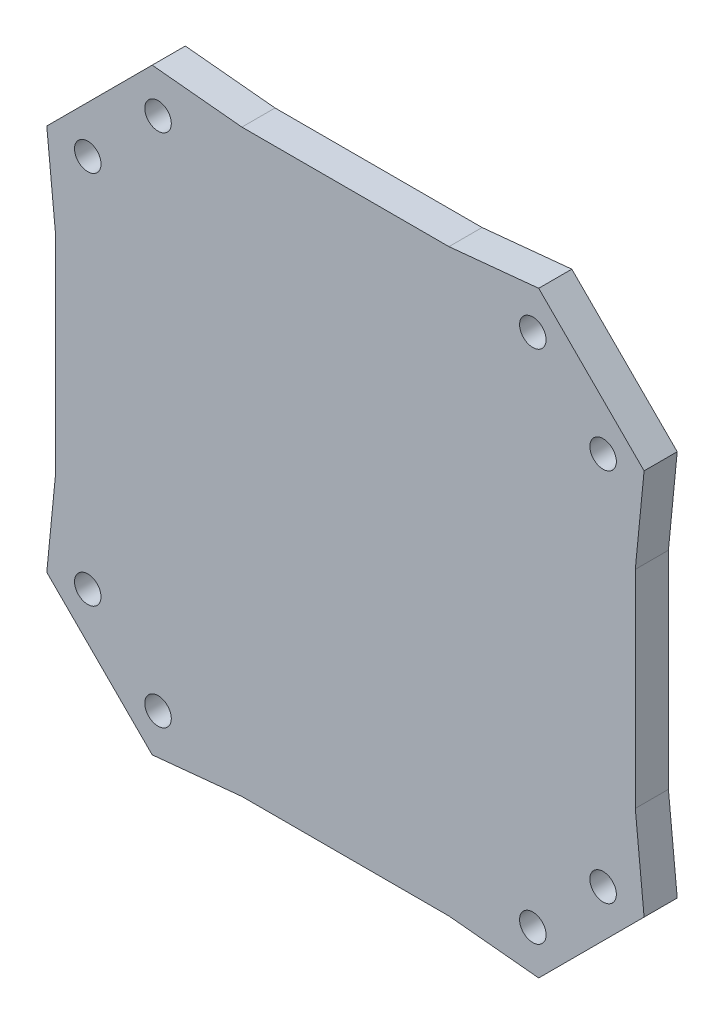
ISO-10303-21;
HEADER;
FILE_DESCRIPTION(('STEP AP214'),'2;1');
FILE_NAME('part.step','',(''),(''),'','','');
FILE_SCHEMA(('AUTOMOTIVE_DESIGN { 1 0 10303 214 1 1 1 1 }'));
ENDSEC;
DATA;
#1=APPLICATION_CONTEXT('core data for automotive mechanical design processes');
#2=APPLICATION_PROTOCOL_DEFINITION('international standard','automotive_design',2000,#1);
#3=PRODUCT_CONTEXT('',#1,'mechanical');
#4=PRODUCT('Part','Part','',(#3));
#5=PRODUCT_RELATED_PRODUCT_CATEGORY('part','',(#4));
#6=PRODUCT_DEFINITION_FORMATION('','',#4);
#7=PRODUCT_DEFINITION_CONTEXT('part definition',#1,'design');
#8=PRODUCT_DEFINITION('design','',#6,#7);
#9=PRODUCT_DEFINITION_SHAPE('','',#8);
#10=(LENGTH_UNIT() NAMED_UNIT(*) SI_UNIT(.MILLI.,.METRE.));
#11=(NAMED_UNIT(*) PLANE_ANGLE_UNIT() SI_UNIT($,.RADIAN.));
#12=(NAMED_UNIT(*) SI_UNIT($,.STERADIAN.) SOLID_ANGLE_UNIT());
#13=UNCERTAINTY_MEASURE_WITH_UNIT(LENGTH_MEASURE(1.E-05),#10,'distance_accuracy_value','');
#14=(GEOMETRIC_REPRESENTATION_CONTEXT(3) GLOBAL_UNCERTAINTY_ASSIGNED_CONTEXT((#13)) GLOBAL_UNIT_ASSIGNED_CONTEXT((#10,
#11,#12)) REPRESENTATION_CONTEXT('',''));
#15=CARTESIAN_POINT('',(0.,0.,0.));
#16=DIRECTION('',(0.,0.,1.));
#17=DIRECTION('',(1.,0.,0.));
#18=AXIS2_PLACEMENT_3D('',#15,#16,#17);
#19=CARTESIAN_POINT('',(0.,0.,4.));
#20=DIRECTION('',(0.,0.,-1.));
#21=DIRECTION('',(-1.,0.,0.));
#22=AXIS2_PLACEMENT_3D('',#19,#20,#21);
#23=PLANE('',#22);
#24=DIRECTION('',(-0.995226405289273,0.0975930438862953,0.));
#25=VECTOR('',#24,1.);
#26=CARTESIAN_POINT('',(-23.334523779157,36.0624458405111,4.));
#27=LINE('',#26,#25);
#28=CARTESIAN_POINT('',(-12.5,35.,4.));
#29=VERTEX_POINT('',#28);
#30=CARTESIAN_POINT('',(-23.334523779157,36.0624458405111,4.));
#31=VERTEX_POINT('',#30);
#32=EDGE_CURVE('E213',#29,#31,#27,.T.);
#33=ORIENTED_EDGE('',*,*,#32,.T.);
#34=DIRECTION('',(-0.707106781186544,-0.707106781186551,0.));
#35=VECTOR('',#34,1.);
#36=CARTESIAN_POINT('',(-36.0624458405148,23.3345237791531,4.));
#37=LINE('',#36,#35);
#38=CARTESIAN_POINT('',(-36.0624458405148,23.3345237791531,4.));
#39=VERTEX_POINT('',#38);
#40=EDGE_CURVE('E121',#31,#39,#37,.T.);
#41=ORIENTED_EDGE('',*,*,#40,.T.);
#42=DIRECTION('',(0.0975930438865594,-0.995226405289247,0.));
#43=VECTOR('',#42,1.);
#44=CARTESIAN_POINT('',(-35.0000000000009,12.4999999999972,4.));
#45=LINE('',#44,#43);
#46=CARTESIAN_POINT('',(-35.0000000000009,12.4999999999972,4.));
#47=VERTEX_POINT('',#46);
#48=EDGE_CURVE('E252',#39,#47,#45,.T.);
#49=ORIENTED_EDGE('',*,*,#48,.T.);
#50=DIRECTION('',(0.,-1.,0.));
#51=VECTOR('',#50,1.);
#52=CARTESIAN_POINT('',(-35.0000000000009,12.4999999999972,4.));
#53=LINE('',#52,#51);
#54=CARTESIAN_POINT('',(-35.0000000000009,-12.5000000000028,4.));
#55=VERTEX_POINT('',#54);
#56=EDGE_CURVE('E271',#47,#55,#53,.T.);
#57=ORIENTED_EDGE('',*,*,#56,.T.);
#58=DIRECTION('',(-0.097593043886296,-0.995226405289273,0.));
#59=VECTOR('',#58,1.);
#60=CARTESIAN_POINT('',(-36.062445840512,-23.3345237791598,4.));
#61=LINE('',#60,#59);
#62=CARTESIAN_POINT('',(-36.062445840512,-23.3345237791598,4.));
#63=VERTEX_POINT('',#62);
#64=EDGE_CURVE('E268',#55,#63,#61,.T.);
#65=ORIENTED_EDGE('',*,*,#64,.T.);
#66=DIRECTION('',(0.707106781186547,-0.707106781186548,0.));
#67=VECTOR('',#66,1.);
#68=CARTESIAN_POINT('',(-23.3345237791541,-36.0624458405177,4.));
#69=LINE('',#68,#67);
#70=CARTESIAN_POINT('',(-23.3345237791541,-36.0624458405177,4.));
#71=VERTEX_POINT('',#70);
#72=EDGE_CURVE('E270',#63,#71,#69,.T.);
#73=ORIENTED_EDGE('',*,*,#72,.T.);
#74=DIRECTION('',(0.995226405289247,0.0975930438865601,0.));
#75=VECTOR('',#74,1.);
#76=CARTESIAN_POINT('',(-12.4999999999981,-35.0000000000038,4.));
#77=LINE('',#76,#75);
#78=CARTESIAN_POINT('',(-12.4999999999981,-35.0000000000038,4.));
#79=VERTEX_POINT('',#78);
#80=EDGE_CURVE('E273',#71,#79,#77,.T.);
#81=ORIENTED_EDGE('',*,*,#80,.T.);
#82=DIRECTION('',(1.,0.,0.));
#83=VECTOR('',#82,1.);
#84=CARTESIAN_POINT('',(-12.4999999999981,-35.0000000000038,4.));
#85=LINE('',#84,#83);
#86=CARTESIAN_POINT('',(12.5000000000019,-35.0000000000038,4.));
#87=VERTEX_POINT('',#86);
#88=EDGE_CURVE('E279',#79,#87,#85,.T.);
#89=ORIENTED_EDGE('',*,*,#88,.T.);
#90=DIRECTION('',(0.995226405289273,-0.097593043886296,0.));
#91=VECTOR('',#90,1.);
#92=CARTESIAN_POINT('',(23.3345237791589,-36.0624458405148,4.));
#93=LINE('',#92,#91);
#94=CARTESIAN_POINT('',(23.3345237791589,-36.0624458405148,4.));
#95=VERTEX_POINT('',#94);
#96=EDGE_CURVE('E281',#87,#95,#93,.T.);
#97=ORIENTED_EDGE('',*,*,#96,.T.);
#98=DIRECTION('',(0.707106781186547,0.707106781186548,0.));
#99=VECTOR('',#98,1.);
#100=CARTESIAN_POINT('',(36.0624458405167,-23.334523779157,4.));
#101=LINE('',#100,#99);
#102=CARTESIAN_POINT('',(36.0624458405167,-23.334523779157,4.));
#103=VERTEX_POINT('',#102);
#104=EDGE_CURVE('E283',#95,#103,#101,.T.);
#105=ORIENTED_EDGE('',*,*,#104,.T.);
#106=DIRECTION('',(-0.0975930438865477,0.995226405289248,0.));
#107=VECTOR('',#106,1.);
#108=CARTESIAN_POINT('',(35.000000000003,-12.5000000000008,4.));
#109=LINE('',#108,#107);
#110=CARTESIAN_POINT('',(35.000000000003,-12.5000000000008,4.));
#111=VERTEX_POINT('',#110);
#112=EDGE_CURVE('E285',#103,#111,#109,.T.);
#113=ORIENTED_EDGE('',*,*,#112,.T.);
#114=DIRECTION('',(0.,1.,0.));
#115=VECTOR('',#114,1.);
#116=CARTESIAN_POINT('',(35.000000000003,-12.5000000000008,4.));
#117=LINE('',#116,#115);
#118=CARTESIAN_POINT('',(35.0000000000028,12.4999999999991,4.));
#119=VERTEX_POINT('',#118);
#120=EDGE_CURVE('E287',#111,#119,#117,.T.);
#121=ORIENTED_EDGE('',*,*,#120,.T.);
#122=DIRECTION('',(0.0975930438862952,0.995226405289273,0.));
#123=VECTOR('',#122,1.);
#124=CARTESIAN_POINT('',(36.0624458405139,23.3345237791561,4.));
#125=LINE('',#124,#123);
#126=CARTESIAN_POINT('',(36.0624458405139,23.3345237791561,4.));
#127=VERTEX_POINT('',#126);
#128=EDGE_CURVE('E164',#119,#127,#125,.T.);
#129=ORIENTED_EDGE('',*,*,#128,.T.);
#130=DIRECTION('',(-0.707106781186547,0.707106781186548,0.));
#131=VECTOR('',#130,1.);
#132=CARTESIAN_POINT('',(23.3345237791561,36.0624458405139,4.));
#133=LINE('',#132,#131);
#134=CARTESIAN_POINT('',(23.3345237791561,36.0624458405139,4.));
#135=VERTEX_POINT('',#134);
#136=EDGE_CURVE('E158',#127,#135,#133,.T.);
#137=ORIENTED_EDGE('',*,*,#136,.T.);
#138=DIRECTION('',(-0.995226405289246,-0.097593043886564,0.));
#139=VECTOR('',#138,1.);
#140=CARTESIAN_POINT('',(12.5,35.,4.));
#141=LINE('',#140,#139);
#142=CARTESIAN_POINT('',(12.5,35.,4.));
#143=VERTEX_POINT('',#142);
#144=EDGE_CURVE('E162',#135,#143,#141,.T.);
#145=ORIENTED_EDGE('',*,*,#144,.T.);
#146=DIRECTION('',(-1.,0.,0.));
#147=VECTOR('',#146,1.);
#148=CARTESIAN_POINT('',(12.5,35.,4.));
#149=LINE('',#148,#147);
#150=EDGE_CURVE('E54',#143,#29,#149,.T.);
#151=ORIENTED_EDGE('',*,*,#150,.T.);
#152=EDGE_LOOP('',(#33,#41,#49,#57,#65,#73,#81,#89,#97,#105,#113,#121,#129,#137,#145,#151));
#153=FACE_BOUND('',#152,.T.);
#154=CARTESIAN_POINT('',(22.6274169979695,31.1126983722081,4.));
#155=DIRECTION('',(0.,0.,1.));
#156=DIRECTION('',(1.,0.,0.));
#157=AXIS2_PLACEMENT_3D('',#154,#155,#156);
#158=CIRCLE('',#157,1.6);
#159=CARTESIAN_POINT('',(24.2274169979695,31.1126983722081,4.));
#160=VERTEX_POINT('',#159);
#161=EDGE_CURVE('E186',#160,#160,#158,.T.);
#162=ORIENTED_EDGE('',*,*,#161,.F.);
#163=EDGE_LOOP('',(#162));
#164=FACE_BOUND('',#163,.T.);
#165=CARTESIAN_POINT('',(31.1126983722082,22.6274169979697,4.));
#166=DIRECTION('',(0.,0.,1.));
#167=DIRECTION('',(1.,0.,0.));
#168=AXIS2_PLACEMENT_3D('',#165,#166,#167);
#169=CIRCLE('',#168,1.59999999999982);
#170=CARTESIAN_POINT('',(32.712698372208,22.6274169979697,4.));
#171=VERTEX_POINT('',#170);
#172=EDGE_CURVE('E391',#171,#171,#169,.T.);
#173=ORIENTED_EDGE('',*,*,#172,.F.);
#174=EDGE_LOOP('',(#173));
#175=FACE_BOUND('',#174,.T.);
#176=CARTESIAN_POINT('',(31.1126983722109,-22.6274169979704,4.));
#177=DIRECTION('',(0.,0.,1.));
#178=DIRECTION('',(1.,0.,0.));
#179=AXIS2_PLACEMENT_3D('',#176,#177,#178);
#180=CIRCLE('',#179,1.59999999999838);
#181=CARTESIAN_POINT('',(32.7126983722093,-22.6274169979704,4.));
#182=VERTEX_POINT('',#181);
#183=EDGE_CURVE('E385',#182,#182,#180,.T.);
#184=ORIENTED_EDGE('',*,*,#183,.F.);
#185=EDGE_LOOP('',(#184));
#186=FACE_BOUND('',#185,.T.);
#187=CARTESIAN_POINT('',(22.6274169979723,-31.112698372209,4.));
#188=DIRECTION('',(0.,0.,1.));
#189=DIRECTION('',(1.,0.,0.));
#190=AXIS2_PLACEMENT_3D('',#187,#188,#189);
#191=CIRCLE('',#190,1.59999999999834);
#192=CARTESIAN_POINT('',(24.2274169979707,-31.112698372209,4.));
#193=VERTEX_POINT('',#192);
#194=EDGE_CURVE('E379',#193,#193,#191,.T.);
#195=ORIENTED_EDGE('',*,*,#194,.F.);
#196=EDGE_LOOP('',(#195));
#197=FACE_BOUND('',#196,.T.);
#198=CARTESIAN_POINT('',(-22.6274169979676,-31.1126983722118,4.));
#199=DIRECTION('',(0.,0.,1.));
#200=DIRECTION('',(1.,0.,0.));
#201=AXIS2_PLACEMENT_3D('',#198,#199,#200);
#202=CIRCLE('',#201,1.60000000000093);
#203=CARTESIAN_POINT('',(-21.0274169979667,-31.1126983722118,4.));
#204=VERTEX_POINT('',#203);
#205=EDGE_CURVE('E373',#204,#204,#202,.T.);
#206=ORIENTED_EDGE('',*,*,#205,.F.);
#207=EDGE_LOOP('',(#206));
#208=FACE_BOUND('',#207,.T.);
#209=CARTESIAN_POINT('',(-31.1126983722062,-22.6274169979733,4.));
#210=DIRECTION('',(0.,0.,1.));
#211=DIRECTION('',(1.,0.,0.));
#212=AXIS2_PLACEMENT_3D('',#209,#210,#211);
#213=CIRCLE('',#212,1.60000000000085);
#214=CARTESIAN_POINT('',(-29.5126983722053,-22.6274169979733,4.));
#215=VERTEX_POINT('',#214);
#216=EDGE_CURVE('E367',#215,#215,#213,.T.);
#217=ORIENTED_EDGE('',*,*,#216,.F.);
#218=EDGE_LOOP('',(#217));
#219=FACE_BOUND('',#218,.T.);
#220=CARTESIAN_POINT('',(-31.112698372209,22.6274169979667,4.));
#221=DIRECTION('',(0.,0.,1.));
#222=DIRECTION('',(1.,0.,0.));
#223=AXIS2_PLACEMENT_3D('',#220,#221,#222);
#224=CIRCLE('',#223,1.60000000000269);
#225=CARTESIAN_POINT('',(-29.5126983722063,22.6274169979667,4.));
#226=VERTEX_POINT('',#225);
#227=EDGE_CURVE('E361',#226,#226,#224,.T.);
#228=ORIENTED_EDGE('',*,*,#227,.F.);
#229=EDGE_LOOP('',(#228));
#230=FACE_BOUND('',#229,.T.);
#231=CARTESIAN_POINT('',(-22.6274169979704,31.1126983722053,4.));
#232=DIRECTION('',(0.,0.,1.));
#233=DIRECTION('',(1.,0.,0.));
#234=AXIS2_PLACEMENT_3D('',#231,#232,#233);
#235=CIRCLE('',#234,1.60000000000258);
#236=CARTESIAN_POINT('',(-21.0274169979678,31.1126983722053,4.));
#237=VERTEX_POINT('',#236);
#238=EDGE_CURVE('E352',#237,#237,#235,.T.);
#239=ORIENTED_EDGE('',*,*,#238,.F.);
#240=EDGE_LOOP('',(#239));
#241=FACE_BOUND('',#240,.T.);
#242=ADVANCED_FACE('F37',(#153,#164,#175,#186,#197,#208,#219,#230,#241),#23,.F.);
#243=CARTESIAN_POINT('',(0.,0.,0.));
#244=DIRECTION('',(0.,0.,-1.));
#245=DIRECTION('',(-1.,0.,0.));
#246=AXIS2_PLACEMENT_3D('',#243,#244,#245);
#247=PLANE('',#246);
#248=CARTESIAN_POINT('',(-31.112698372209,22.6274169979667,0.));
#249=DIRECTION('',(0.,0.,1.));
#250=DIRECTION('',(1.,0.,0.));
#251=AXIS2_PLACEMENT_3D('',#248,#249,#250);
#252=CIRCLE('',#251,1.60000000000269);
#253=CARTESIAN_POINT('',(-29.5126983722063,22.6274169979667,0.));
#254=VERTEX_POINT('',#253);
#255=EDGE_CURVE('E358',#254,#254,#252,.T.);
#256=ORIENTED_EDGE('',*,*,#255,.T.);
#257=EDGE_LOOP('',(#256));
#258=FACE_BOUND('',#257,.T.);
#259=CARTESIAN_POINT('',(-22.6274169979676,-31.1126983722118,0.));
#260=DIRECTION('',(0.,0.,1.));
#261=DIRECTION('',(1.,0.,0.));
#262=AXIS2_PLACEMENT_3D('',#259,#260,#261);
#263=CIRCLE('',#262,1.60000000000093);
#264=CARTESIAN_POINT('',(-21.0274169979667,-31.1126983722118,0.));
#265=VERTEX_POINT('',#264);
#266=EDGE_CURVE('E370',#265,#265,#263,.T.);
#267=ORIENTED_EDGE('',*,*,#266,.T.);
#268=EDGE_LOOP('',(#267));
#269=FACE_BOUND('',#268,.T.);
#270=CARTESIAN_POINT('',(31.1126983722109,-22.6274169979704,0.));
#271=DIRECTION('',(0.,0.,1.));
#272=DIRECTION('',(1.,0.,0.));
#273=AXIS2_PLACEMENT_3D('',#270,#271,#272);
#274=CIRCLE('',#273,1.59999999999838);
#275=CARTESIAN_POINT('',(32.7126983722093,-22.6274169979704,0.));
#276=VERTEX_POINT('',#275);
#277=EDGE_CURVE('E382',#276,#276,#274,.T.);
#278=ORIENTED_EDGE('',*,*,#277,.T.);
#279=EDGE_LOOP('',(#278));
#280=FACE_BOUND('',#279,.T.);
#281=CARTESIAN_POINT('',(22.6274169979695,31.1126983722081,0.));
#282=DIRECTION('',(0.,0.,1.));
#283=DIRECTION('',(1.,0.,0.));
#284=AXIS2_PLACEMENT_3D('',#281,#282,#283);
#285=CIRCLE('',#284,1.6);
#286=CARTESIAN_POINT('',(24.2274169979695,31.1126983722081,0.));
#287=VERTEX_POINT('',#286);
#288=EDGE_CURVE('E394',#287,#287,#285,.T.);
#289=ORIENTED_EDGE('',*,*,#288,.T.);
#290=EDGE_LOOP('',(#289));
#291=FACE_BOUND('',#290,.T.);
#292=DIRECTION('',(-0.995226405289273,0.0975930438862953,0.));
#293=VECTOR('',#292,1.);
#294=CARTESIAN_POINT('',(-23.334523779157,36.0624458405111,0.));
#295=LINE('',#294,#293);
#296=CARTESIAN_POINT('',(-12.5,35.,0.));
#297=VERTEX_POINT('',#296);
#298=CARTESIAN_POINT('',(-23.334523779157,36.0624458405111,0.));
#299=VERTEX_POINT('',#298);
#300=EDGE_CURVE('E182',#297,#299,#295,.T.);
#301=ORIENTED_EDGE('',*,*,#300,.F.);
#302=DIRECTION('',(-1.,0.,0.));
#303=VECTOR('',#302,1.);
#304=CARTESIAN_POINT('',(12.5,35.,0.));
#305=LINE('',#304,#303);
#306=CARTESIAN_POINT('',(12.5,35.,0.));
#307=VERTEX_POINT('',#306);
#308=EDGE_CURVE('E113',#307,#297,#305,.T.);
#309=ORIENTED_EDGE('',*,*,#308,.F.);
#310=DIRECTION('',(-0.995226405289246,-0.097593043886564,0.));
#311=VECTOR('',#310,1.);
#312=CARTESIAN_POINT('',(12.5,35.,0.));
#313=LINE('',#312,#311);
#314=CARTESIAN_POINT('',(23.3345237791561,36.0624458405139,0.));
#315=VERTEX_POINT('',#314);
#316=EDGE_CURVE('E107',#315,#307,#313,.T.);
#317=ORIENTED_EDGE('',*,*,#316,.F.);
#318=DIRECTION('',(-0.707106781186547,0.707106781186548,0.));
#319=VECTOR('',#318,1.);
#320=CARTESIAN_POINT('',(23.3345237791561,36.0624458405139,0.));
#321=LINE('',#320,#319);
#322=CARTESIAN_POINT('',(36.0624458405139,23.3345237791561,0.));
#323=VERTEX_POINT('',#322);
#324=EDGE_CURVE('E172',#323,#315,#321,.T.);
#325=ORIENTED_EDGE('',*,*,#324,.F.);
#326=DIRECTION('',(0.0975930438862952,0.995226405289273,0.));
#327=VECTOR('',#326,1.);
#328=CARTESIAN_POINT('',(36.0624458405139,23.3345237791561,0.));
#329=LINE('',#328,#327);
#330=CARTESIAN_POINT('',(35.0000000000028,12.4999999999991,0.));
#331=VERTEX_POINT('',#330);
#332=EDGE_CURVE('E208',#331,#323,#329,.T.);
#333=ORIENTED_EDGE('',*,*,#332,.F.);
#334=DIRECTION('',(0.,1.,0.));
#335=VECTOR('',#334,1.);
#336=CARTESIAN_POINT('',(35.000000000003,-12.5000000000008,0.));
#337=LINE('',#336,#335);
#338=CARTESIAN_POINT('',(35.000000000003,-12.5000000000008,0.));
#339=VERTEX_POINT('',#338);
#340=EDGE_CURVE('E206',#339,#331,#337,.T.);
#341=ORIENTED_EDGE('',*,*,#340,.F.);
#342=DIRECTION('',(-0.0975930438865477,0.995226405289248,0.));
#343=VECTOR('',#342,1.);
#344=CARTESIAN_POINT('',(35.000000000003,-12.5000000000008,0.));
#345=LINE('',#344,#343);
#346=CARTESIAN_POINT('',(36.0624458405167,-23.334523779157,0.));
#347=VERTEX_POINT('',#346);
#348=EDGE_CURVE('E204',#347,#339,#345,.T.);
#349=ORIENTED_EDGE('',*,*,#348,.F.);
#350=DIRECTION('',(0.707106781186547,0.707106781186548,0.));
#351=VECTOR('',#350,1.);
#352=CARTESIAN_POINT('',(36.0624458405167,-23.334523779157,0.));
#353=LINE('',#352,#351);
#354=CARTESIAN_POINT('',(23.3345237791589,-36.0624458405148,0.));
#355=VERTEX_POINT('',#354);
#356=EDGE_CURVE('E202',#355,#347,#353,.T.);
#357=ORIENTED_EDGE('',*,*,#356,.F.);
#358=DIRECTION('',(0.995226405289273,-0.097593043886296,0.));
#359=VECTOR('',#358,1.);
#360=CARTESIAN_POINT('',(23.3345237791589,-36.0624458405148,0.));
#361=LINE('',#360,#359);
#362=CARTESIAN_POINT('',(12.5000000000019,-35.0000000000038,0.));
#363=VERTEX_POINT('',#362);
#364=EDGE_CURVE('E200',#363,#355,#361,.T.);
#365=ORIENTED_EDGE('',*,*,#364,.F.);
#366=DIRECTION('',(1.,0.,0.));
#367=VECTOR('',#366,1.);
#368=CARTESIAN_POINT('',(-12.4999999999981,-35.0000000000038,0.));
#369=LINE('',#368,#367);
#370=CARTESIAN_POINT('',(-12.4999999999981,-35.0000000000038,0.));
#371=VERTEX_POINT('',#370);
#372=EDGE_CURVE('E198',#371,#363,#369,.T.);
#373=ORIENTED_EDGE('',*,*,#372,.F.);
#374=DIRECTION('',(0.995226405289247,0.0975930438865601,0.));
#375=VECTOR('',#374,1.);
#376=CARTESIAN_POINT('',(-12.4999999999981,-35.0000000000038,0.));
#377=LINE('',#376,#375);
#378=CARTESIAN_POINT('',(-23.3345237791541,-36.0624458405177,0.));
#379=VERTEX_POINT('',#378);
#380=EDGE_CURVE('E196',#379,#371,#377,.T.);
#381=ORIENTED_EDGE('',*,*,#380,.F.);
#382=DIRECTION('',(0.707106781186547,-0.707106781186548,0.));
#383=VECTOR('',#382,1.);
#384=CARTESIAN_POINT('',(-23.3345237791541,-36.0624458405177,0.));
#385=LINE('',#384,#383);
#386=CARTESIAN_POINT('',(-36.062445840512,-23.3345237791598,0.));
#387=VERTEX_POINT('',#386);
#388=EDGE_CURVE('E194',#387,#379,#385,.T.);
#389=ORIENTED_EDGE('',*,*,#388,.F.);
#390=DIRECTION('',(-0.097593043886296,-0.995226405289273,0.));
#391=VECTOR('',#390,1.);
#392=CARTESIAN_POINT('',(-36.062445840512,-23.3345237791598,0.));
#393=LINE('',#392,#391);
#394=CARTESIAN_POINT('',(-35.0000000000009,-12.5000000000028,0.));
#395=VERTEX_POINT('',#394);
#396=EDGE_CURVE('E192',#395,#387,#393,.T.);
#397=ORIENTED_EDGE('',*,*,#396,.F.);
#398=DIRECTION('',(0.,-1.,0.));
#399=VECTOR('',#398,1.);
#400=CARTESIAN_POINT('',(-35.0000000000009,12.4999999999972,0.));
#401=LINE('',#400,#399);
#402=CARTESIAN_POINT('',(-35.0000000000009,12.4999999999972,0.));
#403=VERTEX_POINT('',#402);
#404=EDGE_CURVE('E190',#403,#395,#401,.T.);
#405=ORIENTED_EDGE('',*,*,#404,.F.);
#406=DIRECTION('',(0.0975930438865594,-0.995226405289247,0.));
#407=VECTOR('',#406,1.);
#408=CARTESIAN_POINT('',(-35.0000000000009,12.4999999999972,0.));
#409=LINE('',#408,#407);
#410=CARTESIAN_POINT('',(-36.0624458405148,23.3345237791531,0.));
#411=VERTEX_POINT('',#410);
#412=EDGE_CURVE('E188',#411,#403,#409,.T.);
#413=ORIENTED_EDGE('',*,*,#412,.F.);
#414=DIRECTION('',(-0.707106781186544,-0.707106781186551,0.));
#415=VECTOR('',#414,1.);
#416=CARTESIAN_POINT('',(-36.0624458405148,23.3345237791531,0.));
#417=LINE('',#416,#415);
#418=EDGE_CURVE('E185',#299,#411,#417,.T.);
#419=ORIENTED_EDGE('',*,*,#418,.F.);
#420=EDGE_LOOP('',(#301,#309,#317,#325,#333,#341,#349,#357,#365,#373,#381,#389,#397,#405,#413,#419));
#421=FACE_BOUND('',#420,.T.);
#422=CARTESIAN_POINT('',(31.1126983722082,22.6274169979697,0.));
#423=DIRECTION('',(0.,0.,1.));
#424=DIRECTION('',(1.,0.,0.));
#425=AXIS2_PLACEMENT_3D('',#422,#423,#424);
#426=CIRCLE('',#425,1.59999999999982);
#427=CARTESIAN_POINT('',(32.712698372208,22.6274169979697,0.));
#428=VERTEX_POINT('',#427);
#429=EDGE_CURVE('E388',#428,#428,#426,.T.);
#430=ORIENTED_EDGE('',*,*,#429,.T.);
#431=EDGE_LOOP('',(#430));
#432=FACE_BOUND('',#431,.T.);
#433=CARTESIAN_POINT('',(22.6274169979723,-31.112698372209,0.));
#434=DIRECTION('',(0.,0.,1.));
#435=DIRECTION('',(1.,0.,0.));
#436=AXIS2_PLACEMENT_3D('',#433,#434,#435);
#437=CIRCLE('',#436,1.59999999999834);
#438=CARTESIAN_POINT('',(24.2274169979707,-31.112698372209,0.));
#439=VERTEX_POINT('',#438);
#440=EDGE_CURVE('E376',#439,#439,#437,.T.);
#441=ORIENTED_EDGE('',*,*,#440,.T.);
#442=EDGE_LOOP('',(#441));
#443=FACE_BOUND('',#442,.T.);
#444=CARTESIAN_POINT('',(-31.1126983722062,-22.6274169979733,0.));
#445=DIRECTION('',(0.,0.,1.));
#446=DIRECTION('',(1.,0.,0.));
#447=AXIS2_PLACEMENT_3D('',#444,#445,#446);
#448=CIRCLE('',#447,1.60000000000085);
#449=CARTESIAN_POINT('',(-29.5126983722053,-22.6274169979733,0.));
#450=VERTEX_POINT('',#449);
#451=EDGE_CURVE('E364',#450,#450,#448,.T.);
#452=ORIENTED_EDGE('',*,*,#451,.T.);
#453=EDGE_LOOP('',(#452));
#454=FACE_BOUND('',#453,.T.);
#455=CARTESIAN_POINT('',(-22.6274169979704,31.1126983722053,0.));
#456=DIRECTION('',(0.,0.,1.));
#457=DIRECTION('',(1.,0.,0.));
#458=AXIS2_PLACEMENT_3D('',#455,#456,#457);
#459=CIRCLE('',#458,1.60000000000258);
#460=CARTESIAN_POINT('',(-21.0274169979678,31.1126983722053,0.));
#461=VERTEX_POINT('',#460);
#462=EDGE_CURVE('E355',#461,#461,#459,.T.);
#463=ORIENTED_EDGE('',*,*,#462,.T.);
#464=EDGE_LOOP('',(#463));
#465=FACE_BOUND('',#464,.T.);
#466=ADVANCED_FACE('F256',(#258,#269,#280,#291,#421,#432,#443,#454,#465),#247,.T.);
#467=CARTESIAN_POINT('',(-23.334523779157,36.0624458405111,4.));
#468=DIRECTION('',(-0.0975930438862953,-0.995226405289273,0.));
#469=DIRECTION('',(0.995226405289273,-0.0975930438862953,0.));
#470=AXIS2_PLACEMENT_3D('',#467,#468,#469);
#471=PLANE('',#470);
#472=ORIENTED_EDGE('',*,*,#300,.T.);
#473=DIRECTION('',(0.,0.,-1.));
#474=VECTOR('',#473,1.);
#475=CARTESIAN_POINT('',(-23.334523779157,36.0624458405111,4.));
#476=LINE('',#475,#474);
#477=EDGE_CURVE('E11',#31,#299,#476,.T.);
#478=ORIENTED_EDGE('',*,*,#477,.F.);
#479=ORIENTED_EDGE('',*,*,#32,.F.);
#480=DIRECTION('',(0.,0.,-1.));
#481=VECTOR('',#480,1.);
#482=CARTESIAN_POINT('',(-12.5,35.,4.));
#483=LINE('',#482,#481);
#484=EDGE_CURVE('E178',#29,#297,#483,.T.);
#485=ORIENTED_EDGE('',*,*,#484,.T.);
#486=EDGE_LOOP('',(#472,#478,#479,#485));
#487=FACE_BOUND('',#486,.T.);
#488=ADVANCED_FACE('F39',(#487),#471,.F.);
#489=CARTESIAN_POINT('',(-36.0624458405148,23.3345237791531,4.));
#490=DIRECTION('',(0.707106781186552,-0.707106781186544,0.));
#491=DIRECTION('',(0.707106781186544,0.707106781186552,0.));
#492=AXIS2_PLACEMENT_3D('',#489,#490,#491);
#493=PLANE('',#492);
#494=ORIENTED_EDGE('',*,*,#418,.T.);
#495=DIRECTION('',(0.,0.,-1.));
#496=VECTOR('',#495,1.);
#497=CARTESIAN_POINT('',(-36.0624458405148,23.3345237791531,4.));
#498=LINE('',#497,#496);
#499=EDGE_CURVE('E46',#39,#411,#498,.T.);
#500=ORIENTED_EDGE('',*,*,#499,.F.);
#501=ORIENTED_EDGE('',*,*,#40,.F.);
#502=ORIENTED_EDGE('',*,*,#477,.T.);
#503=EDGE_LOOP('',(#494,#500,#501,#502));
#504=FACE_BOUND('',#503,.T.);
#505=ADVANCED_FACE('F582',(#504),#493,.F.);
#506=CARTESIAN_POINT('',(-35.0000000000009,12.4999999999972,4.));
#507=DIRECTION('',(0.995226405289247,0.0975930438865594,0.));
#508=DIRECTION('',(-0.0975930438865594,0.995226405289247,0.));
#509=AXIS2_PLACEMENT_3D('',#506,#507,#508);
#510=PLANE('',#509);
#511=ORIENTED_EDGE('',*,*,#412,.T.);
#512=DIRECTION('',(0.,0.,-1.));
#513=VECTOR('',#512,1.);
#514=CARTESIAN_POINT('',(-35.0000000000009,12.4999999999972,4.));
#515=LINE('',#514,#513);
#516=EDGE_CURVE('E244',#47,#403,#515,.T.);
#517=ORIENTED_EDGE('',*,*,#516,.F.);
#518=ORIENTED_EDGE('',*,*,#48,.F.);
#519=ORIENTED_EDGE('',*,*,#499,.T.);
#520=EDGE_LOOP('',(#511,#517,#518,#519));
#521=FACE_BOUND('',#520,.T.);
#522=ADVANCED_FACE('F250',(#521),#510,.F.);
#523=CARTESIAN_POINT('',(-35.0000000000009,12.4999999999972,4.));
#524=DIRECTION('',(1.,0.,0.));
#525=DIRECTION('',(0.,1.,0.));
#526=AXIS2_PLACEMENT_3D('',#523,#524,#525);
#527=PLANE('',#526);
#528=ORIENTED_EDGE('',*,*,#404,.T.);
#529=DIRECTION('',(0.,0.,-1.));
#530=VECTOR('',#529,1.);
#531=CARTESIAN_POINT('',(-35.0000000000009,-12.5000000000028,4.));
#532=LINE('',#531,#530);
#533=EDGE_CURVE('E241',#55,#395,#532,.T.);
#534=ORIENTED_EDGE('',*,*,#533,.F.);
#535=ORIENTED_EDGE('',*,*,#56,.F.);
#536=ORIENTED_EDGE('',*,*,#516,.T.);
#537=EDGE_LOOP('',(#528,#534,#535,#536));
#538=FACE_BOUND('',#537,.T.);
#539=ADVANCED_FACE('F262',(#538),#527,.F.);
#540=CARTESIAN_POINT('',(-36.062445840512,-23.3345237791598,4.));
#541=DIRECTION('',(0.995226405289273,-0.0975930438862961,0.));
#542=DIRECTION('',(0.097593043886296,0.995226405289273,0.));
#543=AXIS2_PLACEMENT_3D('',#540,#541,#542);
#544=PLANE('',#543);
#545=ORIENTED_EDGE('',*,*,#396,.T.);
#546=DIRECTION('',(0.,0.,-1.));
#547=VECTOR('',#546,1.);
#548=CARTESIAN_POINT('',(-36.062445840512,-23.3345237791598,4.));
#549=LINE('',#548,#547);
#550=EDGE_CURVE('E238',#63,#387,#549,.T.);
#551=ORIENTED_EDGE('',*,*,#550,.F.);
#552=ORIENTED_EDGE('',*,*,#64,.F.);
#553=ORIENTED_EDGE('',*,*,#533,.T.);
#554=EDGE_LOOP('',(#545,#551,#552,#553));
#555=FACE_BOUND('',#554,.T.);
#556=ADVANCED_FACE('F266',(#555),#544,.F.);
#557=CARTESIAN_POINT('',(-23.3345237791541,-36.0624458405177,4.));
#558=DIRECTION('',(0.707106781186548,0.707106781186547,0.));
#559=DIRECTION('',(-0.707106781186547,0.707106781186548,0.));
#560=AXIS2_PLACEMENT_3D('',#557,#558,#559);
#561=PLANE('',#560);
#562=ORIENTED_EDGE('',*,*,#388,.T.);
#563=DIRECTION('',(0.,0.,-1.));
#564=VECTOR('',#563,1.);
#565=CARTESIAN_POINT('',(-23.3345237791541,-36.0624458405177,4.));
#566=LINE('',#565,#564);
#567=EDGE_CURVE('E235',#71,#379,#566,.T.);
#568=ORIENTED_EDGE('',*,*,#567,.F.);
#569=ORIENTED_EDGE('',*,*,#72,.F.);
#570=ORIENTED_EDGE('',*,*,#550,.T.);
#571=EDGE_LOOP('',(#562,#568,#569,#570));
#572=FACE_BOUND('',#571,.T.);
#573=ADVANCED_FACE('F547',(#572),#561,.F.);
#574=CARTESIAN_POINT('',(-12.4999999999981,-35.0000000000038,4.));
#575=DIRECTION('',(-0.0975930438865601,0.995226405289247,0.));
#576=DIRECTION('',(-0.995226405289247,-0.0975930438865602,0.));
#577=AXIS2_PLACEMENT_3D('',#574,#575,#576);
#578=PLANE('',#577);
#579=ORIENTED_EDGE('',*,*,#380,.T.);
#580=DIRECTION('',(0.,0.,-1.));
#581=VECTOR('',#580,1.);
#582=CARTESIAN_POINT('',(-12.4999999999981,-35.0000000000038,4.));
#583=LINE('',#582,#581);
#584=EDGE_CURVE('E232',#79,#371,#583,.T.);
#585=ORIENTED_EDGE('',*,*,#584,.F.);
#586=ORIENTED_EDGE('',*,*,#80,.F.);
#587=ORIENTED_EDGE('',*,*,#567,.T.);
#588=EDGE_LOOP('',(#579,#585,#586,#587));
#589=FACE_BOUND('',#588,.T.);
#590=ADVANCED_FACE('F537',(#589),#578,.F.);
#591=CARTESIAN_POINT('',(-12.4999999999981,-35.0000000000038,4.));
#592=DIRECTION('',(0.,1.,0.));
#593=DIRECTION('',(-1.,0.,0.));
#594=AXIS2_PLACEMENT_3D('',#591,#592,#593);
#595=PLANE('',#594);
#596=ORIENTED_EDGE('',*,*,#372,.T.);
#597=DIRECTION('',(0.,0.,-1.));
#598=VECTOR('',#597,1.);
#599=CARTESIAN_POINT('',(12.5000000000019,-35.0000000000038,4.));
#600=LINE('',#599,#598);
#601=EDGE_CURVE('E229',#87,#363,#600,.T.);
#602=ORIENTED_EDGE('',*,*,#601,.F.);
#603=ORIENTED_EDGE('',*,*,#88,.F.);
#604=ORIENTED_EDGE('',*,*,#584,.T.);
#605=EDGE_LOOP('',(#596,#602,#603,#604));
#606=FACE_BOUND('',#605,.T.);
#607=ADVANCED_FACE('F527',(#606),#595,.F.);
#608=CARTESIAN_POINT('',(23.3345237791589,-36.0624458405148,4.));
#609=DIRECTION('',(0.097593043886296,0.995226405289273,0.));
#610=DIRECTION('',(-0.995226405289273,0.097593043886296,0.));
#611=AXIS2_PLACEMENT_3D('',#608,#609,#610);
#612=PLANE('',#611);
#613=ORIENTED_EDGE('',*,*,#364,.T.);
#614=DIRECTION('',(0.,0.,-1.));
#615=VECTOR('',#614,1.);
#616=CARTESIAN_POINT('',(23.3345237791589,-36.0624458405148,4.));
#617=LINE('',#616,#615);
#618=EDGE_CURVE('E226',#95,#355,#617,.T.);
#619=ORIENTED_EDGE('',*,*,#618,.F.);
#620=ORIENTED_EDGE('',*,*,#96,.F.);
#621=ORIENTED_EDGE('',*,*,#601,.T.);
#622=EDGE_LOOP('',(#613,#619,#620,#621));
#623=FACE_BOUND('',#622,.T.);
#624=ADVANCED_FACE('F517',(#623),#612,.F.);
#625=CARTESIAN_POINT('',(36.0624458405167,-23.334523779157,4.));
#626=DIRECTION('',(-0.707106781186548,0.707106781186547,0.));
#627=DIRECTION('',(-0.707106781186547,-0.707106781186548,0.));
#628=AXIS2_PLACEMENT_3D('',#625,#626,#627);
#629=PLANE('',#628);
#630=ORIENTED_EDGE('',*,*,#356,.T.);
#631=DIRECTION('',(0.,0.,-1.));
#632=VECTOR('',#631,1.);
#633=CARTESIAN_POINT('',(36.0624458405167,-23.334523779157,4.));
#634=LINE('',#633,#632);
#635=EDGE_CURVE('E223',#103,#347,#634,.T.);
#636=ORIENTED_EDGE('',*,*,#635,.F.);
#637=ORIENTED_EDGE('',*,*,#104,.F.);
#638=ORIENTED_EDGE('',*,*,#618,.T.);
#639=EDGE_LOOP('',(#630,#636,#637,#638));
#640=FACE_BOUND('',#639,.T.);
#641=ADVANCED_FACE('F507',(#640),#629,.F.);
#642=CARTESIAN_POINT('',(35.000000000003,-12.5000000000008,4.));
#643=DIRECTION('',(-0.995226405289248,-0.0975930438865477,0.));
#644=DIRECTION('',(0.0975930438865477,-0.995226405289248,0.));
#645=AXIS2_PLACEMENT_3D('',#642,#643,#644);
#646=PLANE('',#645);
#647=ORIENTED_EDGE('',*,*,#348,.T.);
#648=DIRECTION('',(0.,0.,-1.));
#649=VECTOR('',#648,1.);
#650=CARTESIAN_POINT('',(35.000000000003,-12.5000000000008,4.));
#651=LINE('',#650,#649);
#652=EDGE_CURVE('E220',#111,#339,#651,.T.);
#653=ORIENTED_EDGE('',*,*,#652,.F.);
#654=ORIENTED_EDGE('',*,*,#112,.F.);
#655=ORIENTED_EDGE('',*,*,#635,.T.);
#656=EDGE_LOOP('',(#647,#653,#654,#655));
#657=FACE_BOUND('',#656,.T.);
#658=ADVANCED_FACE('F498',(#657),#646,.F.);
#659=CARTESIAN_POINT('',(35.000000000003,-12.5000000000008,4.));
#660=DIRECTION('',(-1.,0.,0.));
#661=DIRECTION('',(0.,-1.,0.));
#662=AXIS2_PLACEMENT_3D('',#659,#660,#661);
#663=PLANE('',#662);
#664=ORIENTED_EDGE('',*,*,#340,.T.);
#665=DIRECTION('',(0.,0.,-1.));
#666=VECTOR('',#665,1.);
#667=CARTESIAN_POINT('',(35.0000000000028,12.4999999999991,4.));
#668=LINE('',#667,#666);
#669=EDGE_CURVE('E217',#119,#331,#668,.T.);
#670=ORIENTED_EDGE('',*,*,#669,.F.);
#671=ORIENTED_EDGE('',*,*,#120,.F.);
#672=ORIENTED_EDGE('',*,*,#652,.T.);
#673=EDGE_LOOP('',(#664,#670,#671,#672));
#674=FACE_BOUND('',#673,.T.);
#675=ADVANCED_FACE('F293',(#674),#663,.F.);
#676=CARTESIAN_POINT('',(36.0624458405139,23.3345237791561,4.));
#677=DIRECTION('',(-0.995226405289273,0.0975930438862952,0.));
#678=DIRECTION('',(-0.0975930438862952,-0.995226405289273,0.));
#679=AXIS2_PLACEMENT_3D('',#676,#677,#678);
#680=PLANE('',#679);
#681=ORIENTED_EDGE('',*,*,#332,.T.);
#682=DIRECTION('',(0.,0.,-1.));
#683=VECTOR('',#682,1.);
#684=CARTESIAN_POINT('',(36.0624458405139,23.3345237791561,4.));
#685=LINE('',#684,#683);
#686=EDGE_CURVE('E173',#127,#323,#685,.T.);
#687=ORIENTED_EDGE('',*,*,#686,.F.);
#688=ORIENTED_EDGE('',*,*,#128,.F.);
#689=ORIENTED_EDGE('',*,*,#669,.T.);
#690=EDGE_LOOP('',(#681,#687,#688,#689));
#691=FACE_BOUND('',#690,.T.);
#692=ADVANCED_FACE('F297',(#691),#680,.F.);
#693=CARTESIAN_POINT('',(23.3345237791561,36.0624458405139,4.));
#694=DIRECTION('',(-0.707106781186548,-0.707106781186547,0.));
#695=DIRECTION('',(0.707106781186547,-0.707106781186548,0.));
#696=AXIS2_PLACEMENT_3D('',#693,#694,#695);
#697=PLANE('',#696);
#698=ORIENTED_EDGE('',*,*,#324,.T.);
#699=DIRECTION('',(0.,0.,-1.));
#700=VECTOR('',#699,1.);
#701=CARTESIAN_POINT('',(23.3345237791561,36.0624458405139,4.));
#702=LINE('',#701,#700);
#703=EDGE_CURVE('E169',#135,#315,#702,.T.);
#704=ORIENTED_EDGE('',*,*,#703,.F.);
#705=ORIENTED_EDGE('',*,*,#136,.F.);
#706=ORIENTED_EDGE('',*,*,#686,.T.);
#707=EDGE_LOOP('',(#698,#704,#705,#706));
#708=FACE_BOUND('',#707,.T.);
#709=ADVANCED_FACE('F170',(#708),#697,.F.);
#710=CARTESIAN_POINT('',(12.5,35.,4.));
#711=DIRECTION('',(0.097593043886564,-0.995226405289246,0.));
#712=DIRECTION('',(0.995226405289246,0.097593043886564,0.));
#713=AXIS2_PLACEMENT_3D('',#710,#711,#712);
#714=PLANE('',#713);
#715=ORIENTED_EDGE('',*,*,#316,.T.);
#716=DIRECTION('',(0.,0.,-1.));
#717=VECTOR('',#716,1.);
#718=CARTESIAN_POINT('',(12.5,35.,4.));
#719=LINE('',#718,#717);
#720=EDGE_CURVE('E174',#143,#307,#719,.T.);
#721=ORIENTED_EDGE('',*,*,#720,.F.);
#722=ORIENTED_EDGE('',*,*,#144,.F.);
#723=ORIENTED_EDGE('',*,*,#703,.T.);
#724=EDGE_LOOP('',(#715,#721,#722,#723));
#725=FACE_BOUND('',#724,.T.);
#726=ADVANCED_FACE('F176',(#725),#714,.F.);
#727=CARTESIAN_POINT('',(12.5,35.,4.));
#728=DIRECTION('',(0.,-1.,0.));
#729=DIRECTION('',(0.,0.,-1.));
#730=AXIS2_PLACEMENT_3D('',#727,#728,#729);
#731=PLANE('',#730);
#732=ORIENTED_EDGE('',*,*,#308,.T.);
#733=ORIENTED_EDGE('',*,*,#484,.F.);
#734=ORIENTED_EDGE('',*,*,#150,.F.);
#735=ORIENTED_EDGE('',*,*,#720,.T.);
#736=EDGE_LOOP('',(#732,#733,#734,#735));
#737=FACE_BOUND('',#736,.T.);
#738=ADVANCED_FACE('F301',(#737),#731,.F.);
#739=CARTESIAN_POINT('',(22.6274169979695,31.1126983722081,4.));
#740=DIRECTION('',(0.,0.,-1.));
#741=DIRECTION('',(-1.,0.,0.));
#742=AXIS2_PLACEMENT_3D('',#739,#740,#741);
#743=CYLINDRICAL_SURFACE('',#742,1.6);
#744=ORIENTED_EDGE('',*,*,#161,.T.);
#745=EDGE_LOOP('',(#744));
#746=FACE_BOUND('',#745,.T.);
#747=ORIENTED_EDGE('',*,*,#288,.F.);
#748=EDGE_LOOP('',(#747));
#749=FACE_BOUND('',#748,.T.);
#750=ADVANCED_FACE('F303',(#746,#749),#743,.F.);
#751=CARTESIAN_POINT('',(31.1126983722082,22.6274169979697,4.));
#752=DIRECTION('',(0.,0.,-1.));
#753=DIRECTION('',(-1.,0.,0.));
#754=AXIS2_PLACEMENT_3D('',#751,#752,#753);
#755=CYLINDRICAL_SURFACE('',#754,1.59999999999982);
#756=ORIENTED_EDGE('',*,*,#172,.T.);
#757=EDGE_LOOP('',(#756));
#758=FACE_BOUND('',#757,.T.);
#759=ORIENTED_EDGE('',*,*,#429,.F.);
#760=EDGE_LOOP('',(#759));
#761=FACE_BOUND('',#760,.T.);
#762=ADVANCED_FACE('F309',(#758,#761),#755,.F.);
#763=CARTESIAN_POINT('',(31.1126983722109,-22.6274169979704,4.));
#764=DIRECTION('',(0.,0.,-1.));
#765=DIRECTION('',(-1.,0.,0.));
#766=AXIS2_PLACEMENT_3D('',#763,#764,#765);
#767=CYLINDRICAL_SURFACE('',#766,1.59999999999838);
#768=ORIENTED_EDGE('',*,*,#183,.T.);
#769=EDGE_LOOP('',(#768));
#770=FACE_BOUND('',#769,.T.);
#771=ORIENTED_EDGE('',*,*,#277,.F.);
#772=EDGE_LOOP('',(#771));
#773=FACE_BOUND('',#772,.T.);
#774=ADVANCED_FACE('F323',(#770,#773),#767,.F.);
#775=CARTESIAN_POINT('',(22.6274169979723,-31.112698372209,4.));
#776=DIRECTION('',(0.,0.,-1.));
#777=DIRECTION('',(-1.,0.,0.));
#778=AXIS2_PLACEMENT_3D('',#775,#776,#777);
#779=CYLINDRICAL_SURFACE('',#778,1.59999999999834);
#780=ORIENTED_EDGE('',*,*,#194,.T.);
#781=EDGE_LOOP('',(#780));
#782=FACE_BOUND('',#781,.T.);
#783=ORIENTED_EDGE('',*,*,#440,.F.);
#784=EDGE_LOOP('',(#783));
#785=FACE_BOUND('',#784,.T.);
#786=ADVANCED_FACE('F327',(#782,#785),#779,.F.);
#787=CARTESIAN_POINT('',(-22.6274169979676,-31.1126983722118,4.));
#788=DIRECTION('',(0.,0.,-1.));
#789=DIRECTION('',(-1.,0.,0.));
#790=AXIS2_PLACEMENT_3D('',#787,#788,#789);
#791=CYLINDRICAL_SURFACE('',#790,1.60000000000093);
#792=ORIENTED_EDGE('',*,*,#205,.T.);
#793=EDGE_LOOP('',(#792));
#794=FACE_BOUND('',#793,.T.);
#795=ORIENTED_EDGE('',*,*,#266,.F.);
#796=EDGE_LOOP('',(#795));
#797=FACE_BOUND('',#796,.T.);
#798=ADVANCED_FACE('F331',(#794,#797),#791,.F.);
#799=CARTESIAN_POINT('',(-31.1126983722062,-22.6274169979733,4.));
#800=DIRECTION('',(0.,0.,-1.));
#801=DIRECTION('',(-1.,0.,0.));
#802=AXIS2_PLACEMENT_3D('',#799,#800,#801);
#803=CYLINDRICAL_SURFACE('',#802,1.60000000000085);
#804=ORIENTED_EDGE('',*,*,#216,.T.);
#805=EDGE_LOOP('',(#804));
#806=FACE_BOUND('',#805,.T.);
#807=ORIENTED_EDGE('',*,*,#451,.F.);
#808=EDGE_LOOP('',(#807));
#809=FACE_BOUND('',#808,.T.);
#810=ADVANCED_FACE('F335',(#806,#809),#803,.F.);
#811=CARTESIAN_POINT('',(-31.112698372209,22.6274169979667,4.));
#812=DIRECTION('',(0.,0.,-1.));
#813=DIRECTION('',(-1.,0.,0.));
#814=AXIS2_PLACEMENT_3D('',#811,#812,#813);
#815=CYLINDRICAL_SURFACE('',#814,1.60000000000269);
#816=ORIENTED_EDGE('',*,*,#227,.T.);
#817=EDGE_LOOP('',(#816));
#818=FACE_BOUND('',#817,.T.);
#819=ORIENTED_EDGE('',*,*,#255,.F.);
#820=EDGE_LOOP('',(#819));
#821=FACE_BOUND('',#820,.T.);
#822=ADVANCED_FACE('F339',(#818,#821),#815,.F.);
#823=CARTESIAN_POINT('',(-22.6274169979704,31.1126983722053,4.));
#824=DIRECTION('',(0.,0.,-1.));
#825=DIRECTION('',(-1.,0.,0.));
#826=AXIS2_PLACEMENT_3D('',#823,#824,#825);
#827=CYLINDRICAL_SURFACE('',#826,1.60000000000258);
#828=ORIENTED_EDGE('',*,*,#238,.T.);
#829=EDGE_LOOP('',(#828));
#830=FACE_BOUND('',#829,.T.);
#831=ORIENTED_EDGE('',*,*,#462,.F.);
#832=EDGE_LOOP('',(#831));
#833=FACE_BOUND('',#832,.T.);
#834=ADVANCED_FACE('F343',(#830,#833),#827,.F.);
#835=CLOSED_SHELL('',(#242,#466,#488,#505,#522,#539,#556,#573,#590,#607,#624,#641,#658,#675,
#692,#709,#726,#738,#750,#762,#774,#786,#798,#810,#822,#834));
#836=MANIFOLD_SOLID_BREP('B2',#835);
#837=ADVANCED_BREP_SHAPE_REPRESENTATION('',(#18,#836),#14);
#838=SHAPE_DEFINITION_REPRESENTATION(#9,#837);
ENDSEC;
END-ISO-10303-21;
